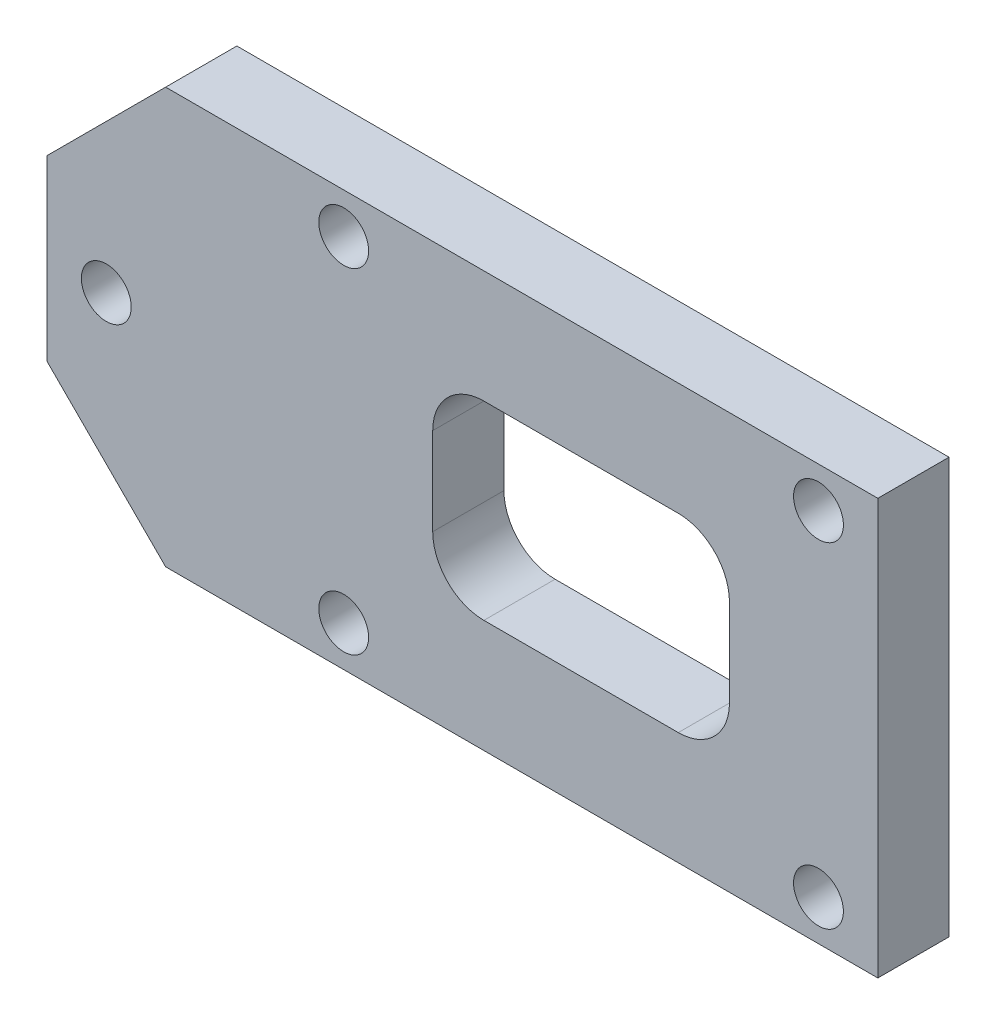
ISO-10303-21;
HEADER;
FILE_DESCRIPTION(('STEP AP214'),'2;1');
FILE_NAME('part.step','',(''),(''),'','','');
FILE_SCHEMA(('AUTOMOTIVE_DESIGN { 1 0 10303 214 1 1 1 1 }'));
ENDSEC;
DATA;
#1=APPLICATION_CONTEXT('core data for automotive mechanical design processes');
#2=APPLICATION_PROTOCOL_DEFINITION('international standard','automotive_design',2000,#1);
#3=PRODUCT_CONTEXT('',#1,'mechanical');
#4=PRODUCT('Part','Part','',(#3));
#5=PRODUCT_RELATED_PRODUCT_CATEGORY('part','',(#4));
#6=PRODUCT_DEFINITION_FORMATION('','',#4);
#7=PRODUCT_DEFINITION_CONTEXT('part definition',#1,'design');
#8=PRODUCT_DEFINITION('design','',#6,#7);
#9=PRODUCT_DEFINITION_SHAPE('','',#8);
#10=(LENGTH_UNIT() NAMED_UNIT(*) SI_UNIT(.MILLI.,.METRE.));
#11=(NAMED_UNIT(*) PLANE_ANGLE_UNIT() SI_UNIT($,.RADIAN.));
#12=(NAMED_UNIT(*) SI_UNIT($,.STERADIAN.) SOLID_ANGLE_UNIT());
#13=UNCERTAINTY_MEASURE_WITH_UNIT(LENGTH_MEASURE(1.E-05),#10,'distance_accuracy_value','');
#14=(GEOMETRIC_REPRESENTATION_CONTEXT(3) GLOBAL_UNCERTAINTY_ASSIGNED_CONTEXT((#13)) GLOBAL_UNIT_ASSIGNED_CONTEXT((#10,
#11,#12)) REPRESENTATION_CONTEXT('',''));
#15=CARTESIAN_POINT('',(0.,0.,0.));
#16=DIRECTION('',(0.,0.,1.));
#17=DIRECTION('',(1.,0.,0.));
#18=AXIS2_PLACEMENT_3D('',#15,#16,#17);
#19=CARTESIAN_POINT('',(0.,0.,6.));
#20=DIRECTION('',(0.,0.,-1.));
#21=DIRECTION('',(-1.,0.,0.));
#22=AXIS2_PLACEMENT_3D('',#19,#20,#21);
#23=PLANE('',#22);
#24=CARTESIAN_POINT('',(5.,17.5,6.));
#25=DIRECTION('',(0.,0.,1.));
#26=DIRECTION('',(1.,0.,0.));
#27=AXIS2_PLACEMENT_3D('',#24,#25,#26);
#28=CIRCLE('',#27,2.1);
#29=CARTESIAN_POINT('',(7.1,17.5,6.));
#30=VERTEX_POINT('',#29);
#31=EDGE_CURVE('E236',#30,#30,#28,.T.);
#32=ORIENTED_EDGE('',*,*,#31,.F.);
#33=EDGE_LOOP('',(#32));
#34=FACE_BOUND('',#33,.T.);
#35=CARTESIAN_POINT('',(25.,3.4,6.));
#36=DIRECTION('',(0.,0.,1.));
#37=DIRECTION('',(-1.,0.,0.));
#38=AXIS2_PLACEMENT_3D('',#35,#36,#37);
#39=CIRCLE('',#38,2.1);
#40=CARTESIAN_POINT('',(22.9,3.4,6.));
#41=VERTEX_POINT('',#40);
#42=EDGE_CURVE('E244',#41,#41,#39,.T.);
#43=ORIENTED_EDGE('',*,*,#42,.F.);
#44=EDGE_LOOP('',(#43));
#45=FACE_BOUND('',#44,.T.);
#46=CARTESIAN_POINT('',(65.,3.4,6.));
#47=DIRECTION('',(0.,0.,1.));
#48=DIRECTION('',(-1.,0.,0.));
#49=AXIS2_PLACEMENT_3D('',#46,#47,#48);
#50=CIRCLE('',#49,2.09999999999999);
#51=CARTESIAN_POINT('',(62.9,3.4,6.));
#52=VERTEX_POINT('',#51);
#53=EDGE_CURVE('E252',#52,#52,#50,.T.);
#54=ORIENTED_EDGE('',*,*,#53,.F.);
#55=EDGE_LOOP('',(#54));
#56=FACE_BOUND('',#55,.T.);
#57=CARTESIAN_POINT('',(25.,31.6,6.));
#58=DIRECTION('',(0.,0.,1.));
#59=DIRECTION('',(1.,0.,0.));
#60=AXIS2_PLACEMENT_3D('',#57,#58,#59);
#61=CIRCLE('',#60,2.1);
#62=CARTESIAN_POINT('',(27.1,31.6,6.));
#63=VERTEX_POINT('',#62);
#64=EDGE_CURVE('E260',#63,#63,#61,.T.);
#65=ORIENTED_EDGE('',*,*,#64,.F.);
#66=EDGE_LOOP('',(#65));
#67=FACE_BOUND('',#66,.T.);
#68=CARTESIAN_POINT('',(65.,31.6,6.));
#69=DIRECTION('',(0.,0.,1.));
#70=DIRECTION('',(1.,0.,0.));
#71=AXIS2_PLACEMENT_3D('',#68,#69,#70);
#72=CIRCLE('',#71,2.09999999999999);
#73=CARTESIAN_POINT('',(67.1,31.6,6.));
#74=VERTEX_POINT('',#73);
#75=EDGE_CURVE('E268',#74,#74,#72,.T.);
#76=ORIENTED_EDGE('',*,*,#75,.F.);
#77=EDGE_LOOP('',(#76));
#78=FACE_BOUND('',#77,.T.);
#79=DIRECTION('',(0.,1.,0.));
#80=VECTOR('',#79,1.);
#81=CARTESIAN_POINT('',(70.,0.,6.));
#82=LINE('',#81,#80);
#83=CARTESIAN_POINT('',(70.,0.,6.));
#84=VERTEX_POINT('',#83);
#85=CARTESIAN_POINT('',(70.,35.,6.));
#86=VERTEX_POINT('',#85);
#87=EDGE_CURVE('E276',#84,#86,#82,.T.);
#88=ORIENTED_EDGE('',*,*,#87,.T.);
#89=DIRECTION('',(-1.,0.,0.));
#90=VECTOR('',#89,1.);
#91=CARTESIAN_POINT('',(10.,35.,6.));
#92=LINE('',#91,#90);
#93=CARTESIAN_POINT('',(10.,35.,6.));
#94=VERTEX_POINT('',#93);
#95=EDGE_CURVE('E280',#86,#94,#92,.T.);
#96=ORIENTED_EDGE('',*,*,#95,.T.);
#97=DIRECTION('',(-0.707106781186547,-0.707106781186548,0.));
#98=VECTOR('',#97,1.);
#99=CARTESIAN_POINT('',(0.,25.,6.));
#100=LINE('',#99,#98);
#101=CARTESIAN_POINT('',(0.,25.,6.));
#102=VERTEX_POINT('',#101);
#103=EDGE_CURVE('E284',#94,#102,#100,.T.);
#104=ORIENTED_EDGE('',*,*,#103,.T.);
#105=DIRECTION('',(0.,-1.,0.));
#106=VECTOR('',#105,1.);
#107=CARTESIAN_POINT('',(0.,10.,6.));
#108=LINE('',#107,#106);
#109=CARTESIAN_POINT('',(0.,10.,6.));
#110=VERTEX_POINT('',#109);
#111=EDGE_CURVE('E287',#102,#110,#108,.T.);
#112=ORIENTED_EDGE('',*,*,#111,.T.);
#113=DIRECTION('',(0.707106781186548,-0.707106781186548,0.));
#114=VECTOR('',#113,1.);
#115=CARTESIAN_POINT('',(10.,0.,6.));
#116=LINE('',#115,#114);
#117=CARTESIAN_POINT('',(10.,0.,6.));
#118=VERTEX_POINT('',#117);
#119=EDGE_CURVE('E290',#110,#118,#116,.T.);
#120=ORIENTED_EDGE('',*,*,#119,.T.);
#121=DIRECTION('',(1.,0.,0.));
#122=VECTOR('',#121,1.);
#123=CARTESIAN_POINT('',(10.,0.,6.));
#124=LINE('',#123,#122);
#125=EDGE_CURVE('E293',#118,#84,#124,.T.);
#126=ORIENTED_EDGE('',*,*,#125,.T.);
#127=EDGE_LOOP('',(#88,#96,#104,#112,#120,#126));
#128=FACE_BOUND('',#127,.T.);
#129=CARTESIAN_POINT('',(36.8110537456806,13.8110537456806,6.));
#130=DIRECTION('',(0.,0.,1.));
#131=DIRECTION('',(1.,0.,0.));
#132=AXIS2_PLACEMENT_3D('',#129,#130,#131);
#133=CIRCLE('',#132,4.31105374568061);
#134=CARTESIAN_POINT('',(32.5,13.8110537456806,6.));
#135=VERTEX_POINT('',#134);
#136=CARTESIAN_POINT('',(36.8110537456806,9.5,6.));
#137=VERTEX_POINT('',#136);
#138=EDGE_CURVE('E147',#135,#137,#133,.T.);
#139=ORIENTED_EDGE('',*,*,#138,.F.);
#140=DIRECTION('',(0.,-1.,0.));
#141=VECTOR('',#140,1.);
#142=CARTESIAN_POINT('',(32.5,13.8110537456806,6.));
#143=LINE('',#142,#141);
#144=CARTESIAN_POINT('',(32.5,21.1889462543194,6.));
#145=VERTEX_POINT('',#144);
#146=EDGE_CURVE('E188',#145,#135,#143,.T.);
#147=ORIENTED_EDGE('',*,*,#146,.F.);
#148=CARTESIAN_POINT('',(36.8110537456806,21.1889462543194,6.));
#149=DIRECTION('',(0.,0.,1.));
#150=DIRECTION('',(1.,0.,0.));
#151=AXIS2_PLACEMENT_3D('',#148,#149,#150);
#152=CIRCLE('',#151,4.31105374568061);
#153=CARTESIAN_POINT('',(36.8110537456806,25.5,6.));
#154=VERTEX_POINT('',#153);
#155=EDGE_CURVE('E185',#154,#145,#152,.T.);
#156=ORIENTED_EDGE('',*,*,#155,.F.);
#157=DIRECTION('',(-1.,0.,0.));
#158=VECTOR('',#157,1.);
#159=CARTESIAN_POINT('',(53.1889462543194,25.5,6.));
#160=LINE('',#159,#158);
#161=CARTESIAN_POINT('',(53.1889462543194,25.5,6.));
#162=VERTEX_POINT('',#161);
#163=EDGE_CURVE('E182',#162,#154,#160,.T.);
#164=ORIENTED_EDGE('',*,*,#163,.F.);
#165=CARTESIAN_POINT('',(53.1889462543194,21.1889462543194,6.));
#166=DIRECTION('',(0.,0.,1.));
#167=DIRECTION('',(1.,0.,0.));
#168=AXIS2_PLACEMENT_3D('',#165,#166,#167);
#169=CIRCLE('',#168,4.3110537456806);
#170=CARTESIAN_POINT('',(57.5,21.1889462543194,6.));
#171=VERTEX_POINT('',#170);
#172=EDGE_CURVE('E179',#171,#162,#169,.T.);
#173=ORIENTED_EDGE('',*,*,#172,.F.);
#174=DIRECTION('',(0.,1.,0.));
#175=VECTOR('',#174,1.);
#176=CARTESIAN_POINT('',(57.5,13.8110537456806,6.));
#177=LINE('',#176,#175);
#178=CARTESIAN_POINT('',(57.5,13.8110537456806,6.));
#179=VERTEX_POINT('',#178);
#180=EDGE_CURVE('E174',#179,#171,#177,.T.);
#181=ORIENTED_EDGE('',*,*,#180,.F.);
#182=CARTESIAN_POINT('',(53.1889462543194,13.8110537456806,6.));
#183=DIRECTION('',(0.,0.,1.));
#184=DIRECTION('',(1.,0.,0.));
#185=AXIS2_PLACEMENT_3D('',#182,#183,#184);
#186=CIRCLE('',#185,4.3110537456806);
#187=CARTESIAN_POINT('',(53.1889462543194,9.50000000000001,6.));
#188=VERTEX_POINT('',#187);
#189=EDGE_CURVE('E170',#188,#179,#186,.T.);
#190=ORIENTED_EDGE('',*,*,#189,.F.);
#191=DIRECTION('',(1.,0.,0.));
#192=VECTOR('',#191,1.);
#193=CARTESIAN_POINT('',(53.1889462543194,9.5,6.));
#194=LINE('',#193,#192);
#195=EDGE_CURVE('E156',#137,#188,#194,.T.);
#196=ORIENTED_EDGE('',*,*,#195,.F.);
#197=EDGE_LOOP('',(#139,#147,#156,#164,#173,#181,#190,#196));
#198=FACE_BOUND('',#197,.T.);
#199=ADVANCED_FACE('F45',(#34,#45,#56,#67,#78,#128,#198),#23,.F.);
#200=CARTESIAN_POINT('',(0.,0.,0.));
#201=DIRECTION('',(0.,0.,-1.));
#202=DIRECTION('',(-1.,0.,0.));
#203=AXIS2_PLACEMENT_3D('',#200,#201,#202);
#204=PLANE('',#203);
#205=CARTESIAN_POINT('',(25.,3.4,0.));
#206=DIRECTION('',(0.,0.,1.));
#207=DIRECTION('',(-1.,0.,0.));
#208=AXIS2_PLACEMENT_3D('',#205,#206,#207);
#209=CIRCLE('',#208,2.1);
#210=CARTESIAN_POINT('',(22.9,3.4,0.));
#211=VERTEX_POINT('',#210);
#212=EDGE_CURVE('E240',#211,#211,#209,.T.);
#213=ORIENTED_EDGE('',*,*,#212,.T.);
#214=EDGE_LOOP('',(#213));
#215=FACE_BOUND('',#214,.T.);
#216=CARTESIAN_POINT('',(25.,31.6,0.));
#217=DIRECTION('',(0.,0.,1.));
#218=DIRECTION('',(1.,0.,0.));
#219=AXIS2_PLACEMENT_3D('',#216,#217,#218);
#220=CIRCLE('',#219,2.1);
#221=CARTESIAN_POINT('',(27.1,31.6,0.));
#222=VERTEX_POINT('',#221);
#223=EDGE_CURVE('E256',#222,#222,#220,.T.);
#224=ORIENTED_EDGE('',*,*,#223,.T.);
#225=EDGE_LOOP('',(#224));
#226=FACE_BOUND('',#225,.T.);
#227=DIRECTION('',(0.,1.,0.));
#228=VECTOR('',#227,1.);
#229=CARTESIAN_POINT('',(70.,0.,0.));
#230=LINE('',#229,#228);
#231=CARTESIAN_POINT('',(70.,0.,0.));
#232=VERTEX_POINT('',#231);
#233=CARTESIAN_POINT('',(70.,35.,0.));
#234=VERTEX_POINT('',#233);
#235=EDGE_CURVE('E272',#232,#234,#230,.T.);
#236=ORIENTED_EDGE('',*,*,#235,.F.);
#237=DIRECTION('',(1.,0.,0.));
#238=VECTOR('',#237,1.);
#239=CARTESIAN_POINT('',(10.,0.,0.));
#240=LINE('',#239,#238);
#241=CARTESIAN_POINT('',(10.,0.,0.));
#242=VERTEX_POINT('',#241);
#243=EDGE_CURVE('E281',#242,#232,#240,.T.);
#244=ORIENTED_EDGE('',*,*,#243,.F.);
#245=DIRECTION('',(0.707106781186548,-0.707106781186548,0.));
#246=VECTOR('',#245,1.);
#247=CARTESIAN_POINT('',(10.,0.,0.));
#248=LINE('',#247,#246);
#249=CARTESIAN_POINT('',(0.,10.,0.));
#250=VERTEX_POINT('',#249);
#251=EDGE_CURVE('E309',#250,#242,#248,.T.);
#252=ORIENTED_EDGE('',*,*,#251,.F.);
#253=DIRECTION('',(0.,-1.,0.));
#254=VECTOR('',#253,1.);
#255=CARTESIAN_POINT('',(0.,10.,0.));
#256=LINE('',#255,#254);
#257=CARTESIAN_POINT('',(0.,25.,0.));
#258=VERTEX_POINT('',#257);
#259=EDGE_CURVE('E306',#258,#250,#256,.T.);
#260=ORIENTED_EDGE('',*,*,#259,.F.);
#261=DIRECTION('',(-0.707106781186547,-0.707106781186548,0.));
#262=VECTOR('',#261,1.);
#263=CARTESIAN_POINT('',(0.,25.,0.));
#264=LINE('',#263,#262);
#265=CARTESIAN_POINT('',(10.,35.,0.));
#266=VERTEX_POINT('',#265);
#267=EDGE_CURVE('E303',#266,#258,#264,.T.);
#268=ORIENTED_EDGE('',*,*,#267,.F.);
#269=DIRECTION('',(-1.,0.,0.));
#270=VECTOR('',#269,1.);
#271=CARTESIAN_POINT('',(10.,35.,0.));
#272=LINE('',#271,#270);
#273=EDGE_CURVE('E300',#234,#266,#272,.T.);
#274=ORIENTED_EDGE('',*,*,#273,.F.);
#275=EDGE_LOOP('',(#236,#244,#252,#260,#268,#274));
#276=FACE_BOUND('',#275,.T.);
#277=CARTESIAN_POINT('',(65.,31.6,0.));
#278=DIRECTION('',(0.,0.,1.));
#279=DIRECTION('',(1.,0.,0.));
#280=AXIS2_PLACEMENT_3D('',#277,#278,#279);
#281=CIRCLE('',#280,2.09999999999999);
#282=CARTESIAN_POINT('',(67.1,31.6,0.));
#283=VERTEX_POINT('',#282);
#284=EDGE_CURVE('E264',#283,#283,#281,.T.);
#285=ORIENTED_EDGE('',*,*,#284,.T.);
#286=EDGE_LOOP('',(#285));
#287=FACE_BOUND('',#286,.T.);
#288=CARTESIAN_POINT('',(65.,3.4,0.));
#289=DIRECTION('',(0.,0.,1.));
#290=DIRECTION('',(-1.,0.,0.));
#291=AXIS2_PLACEMENT_3D('',#288,#289,#290);
#292=CIRCLE('',#291,2.09999999999999);
#293=CARTESIAN_POINT('',(62.9,3.4,0.));
#294=VERTEX_POINT('',#293);
#295=EDGE_CURVE('E248',#294,#294,#292,.T.);
#296=ORIENTED_EDGE('',*,*,#295,.T.);
#297=EDGE_LOOP('',(#296));
#298=FACE_BOUND('',#297,.T.);
#299=CARTESIAN_POINT('',(5.,17.5,0.));
#300=DIRECTION('',(0.,0.,1.));
#301=DIRECTION('',(1.,0.,0.));
#302=AXIS2_PLACEMENT_3D('',#299,#300,#301);
#303=CIRCLE('',#302,2.1);
#304=CARTESIAN_POINT('',(7.1,17.5,0.));
#305=VERTEX_POINT('',#304);
#306=EDGE_CURVE('E165',#305,#305,#303,.T.);
#307=ORIENTED_EDGE('',*,*,#306,.T.);
#308=EDGE_LOOP('',(#307));
#309=FACE_BOUND('',#308,.T.);
#310=DIRECTION('',(0.,-1.,0.));
#311=VECTOR('',#310,1.);
#312=CARTESIAN_POINT('',(32.5,13.8110537456806,0.));
#313=LINE('',#312,#311);
#314=CARTESIAN_POINT('',(32.5,21.1889462543194,0.));
#315=VERTEX_POINT('',#314);
#316=CARTESIAN_POINT('',(32.5,13.8110537456806,0.));
#317=VERTEX_POINT('',#316);
#318=EDGE_CURVE('E157',#315,#317,#313,.T.);
#319=ORIENTED_EDGE('',*,*,#318,.T.);
#320=CARTESIAN_POINT('',(36.8110537456806,13.8110537456806,0.));
#321=DIRECTION('',(0.,0.,1.));
#322=DIRECTION('',(1.,0.,0.));
#323=AXIS2_PLACEMENT_3D('',#320,#321,#322);
#324=CIRCLE('',#323,4.31105374568061);
#325=CARTESIAN_POINT('',(36.8110537456806,9.5,0.));
#326=VERTEX_POINT('',#325);
#327=EDGE_CURVE('E69',#317,#326,#324,.T.);
#328=ORIENTED_EDGE('',*,*,#327,.T.);
#329=DIRECTION('',(1.,0.,0.));
#330=VECTOR('',#329,1.);
#331=CARTESIAN_POINT('',(53.1889462543194,9.5,0.));
#332=LINE('',#331,#330);
#333=CARTESIAN_POINT('',(53.1889462543194,9.50000000000001,0.));
#334=VERTEX_POINT('',#333);
#335=EDGE_CURVE('E163',#326,#334,#332,.T.);
#336=ORIENTED_EDGE('',*,*,#335,.T.);
#337=CARTESIAN_POINT('',(53.1889462543194,13.8110537456806,0.));
#338=DIRECTION('',(0.,0.,1.));
#339=DIRECTION('',(1.,0.,0.));
#340=AXIS2_PLACEMENT_3D('',#337,#338,#339);
#341=CIRCLE('',#340,4.3110537456806);
#342=CARTESIAN_POINT('',(57.5,13.8110537456806,0.));
#343=VERTEX_POINT('',#342);
#344=EDGE_CURVE('E195',#334,#343,#341,.T.);
#345=ORIENTED_EDGE('',*,*,#344,.T.);
#346=DIRECTION('',(0.,1.,0.));
#347=VECTOR('',#346,1.);
#348=CARTESIAN_POINT('',(57.5,13.8110537456806,0.));
#349=LINE('',#348,#347);
#350=CARTESIAN_POINT('',(57.5,21.1889462543194,0.));
#351=VERTEX_POINT('',#350);
#352=EDGE_CURVE('E199',#343,#351,#349,.T.);
#353=ORIENTED_EDGE('',*,*,#352,.T.);
#354=CARTESIAN_POINT('',(53.1889462543194,21.1889462543194,0.));
#355=DIRECTION('',(0.,0.,1.));
#356=DIRECTION('',(1.,0.,0.));
#357=AXIS2_PLACEMENT_3D('',#354,#355,#356);
#358=CIRCLE('',#357,4.3110537456806);
#359=CARTESIAN_POINT('',(53.1889462543194,25.5,0.));
#360=VERTEX_POINT('',#359);
#361=EDGE_CURVE('E203',#351,#360,#358,.T.);
#362=ORIENTED_EDGE('',*,*,#361,.T.);
#363=DIRECTION('',(-1.,0.,0.));
#364=VECTOR('',#363,1.);
#365=CARTESIAN_POINT('',(53.1889462543194,25.5,0.));
#366=LINE('',#365,#364);
#367=CARTESIAN_POINT('',(36.8110537456806,25.5,0.));
#368=VERTEX_POINT('',#367);
#369=EDGE_CURVE('E207',#360,#368,#366,.T.);
#370=ORIENTED_EDGE('',*,*,#369,.T.);
#371=CARTESIAN_POINT('',(36.8110537456806,21.1889462543194,0.));
#372=DIRECTION('',(0.,0.,1.));
#373=DIRECTION('',(1.,0.,0.));
#374=AXIS2_PLACEMENT_3D('',#371,#372,#373);
#375=CIRCLE('',#374,4.31105374568061);
#376=EDGE_CURVE('E211',#368,#315,#375,.T.);
#377=ORIENTED_EDGE('',*,*,#376,.T.);
#378=EDGE_LOOP('',(#319,#328,#336,#345,#353,#362,#370,#377));
#379=FACE_BOUND('',#378,.T.);
#380=ADVANCED_FACE('F340',(#215,#226,#276,#287,#298,#309,#379),#204,.T.);
#381=CARTESIAN_POINT('',(70.,0.,6.));
#382=DIRECTION('',(-1.,0.,0.));
#383=DIRECTION('',(0.,0.,1.));
#384=AXIS2_PLACEMENT_3D('',#381,#382,#383);
#385=PLANE('',#384);
#386=ORIENTED_EDGE('',*,*,#235,.T.);
#387=DIRECTION('',(0.,0.,-1.));
#388=VECTOR('',#387,1.);
#389=CARTESIAN_POINT('',(70.,35.,6.));
#390=LINE('',#389,#388);
#391=EDGE_CURVE('E11',#86,#234,#390,.T.);
#392=ORIENTED_EDGE('',*,*,#391,.F.);
#393=ORIENTED_EDGE('',*,*,#87,.F.);
#394=DIRECTION('',(0.,0.,-1.));
#395=VECTOR('',#394,1.);
#396=CARTESIAN_POINT('',(70.,0.,6.));
#397=LINE('',#396,#395);
#398=EDGE_CURVE('E296',#84,#232,#397,.T.);
#399=ORIENTED_EDGE('',*,*,#398,.T.);
#400=EDGE_LOOP('',(#386,#392,#393,#399));
#401=FACE_BOUND('',#400,.T.);
#402=ADVANCED_FACE('F47',(#401),#385,.F.);
#403=CARTESIAN_POINT('',(10.,35.,6.));
#404=DIRECTION('',(0.,-1.,0.));
#405=DIRECTION('',(0.,0.,-1.));
#406=AXIS2_PLACEMENT_3D('',#403,#404,#405);
#407=PLANE('',#406);
#408=ORIENTED_EDGE('',*,*,#273,.T.);
#409=DIRECTION('',(0.,0.,-1.));
#410=VECTOR('',#409,1.);
#411=CARTESIAN_POINT('',(10.,35.,6.));
#412=LINE('',#411,#410);
#413=EDGE_CURVE('E54',#94,#266,#412,.T.);
#414=ORIENTED_EDGE('',*,*,#413,.F.);
#415=ORIENTED_EDGE('',*,*,#95,.F.);
#416=ORIENTED_EDGE('',*,*,#391,.T.);
#417=EDGE_LOOP('',(#408,#414,#415,#416));
#418=FACE_BOUND('',#417,.T.);
#419=ADVANCED_FACE('F357',(#418),#407,.F.);
#420=CARTESIAN_POINT('',(0.,25.,6.));
#421=DIRECTION('',(0.707106781186548,-0.707106781186547,0.));
#422=DIRECTION('',(0.707106781186547,0.707106781186548,0.));
#423=AXIS2_PLACEMENT_3D('',#420,#421,#422);
#424=PLANE('',#423);
#425=ORIENTED_EDGE('',*,*,#267,.T.);
#426=DIRECTION('',(0.,0.,-1.));
#427=VECTOR('',#426,1.);
#428=CARTESIAN_POINT('',(0.,25.,6.));
#429=LINE('',#428,#427);
#430=EDGE_CURVE('E325',#102,#258,#429,.T.);
#431=ORIENTED_EDGE('',*,*,#430,.F.);
#432=ORIENTED_EDGE('',*,*,#103,.F.);
#433=ORIENTED_EDGE('',*,*,#413,.T.);
#434=EDGE_LOOP('',(#425,#431,#432,#433));
#435=FACE_BOUND('',#434,.T.);
#436=ADVANCED_FACE('F334',(#435),#424,.F.);
#437=CARTESIAN_POINT('',(0.,10.,6.));
#438=DIRECTION('',(1.,0.,0.));
#439=DIRECTION('',(0.,0.,-1.));
#440=AXIS2_PLACEMENT_3D('',#437,#438,#439);
#441=PLANE('',#440);
#442=ORIENTED_EDGE('',*,*,#259,.T.);
#443=DIRECTION('',(0.,0.,-1.));
#444=VECTOR('',#443,1.);
#445=CARTESIAN_POINT('',(0.,10.,6.));
#446=LINE('',#445,#444);
#447=EDGE_CURVE('E321',#110,#250,#446,.T.);
#448=ORIENTED_EDGE('',*,*,#447,.F.);
#449=ORIENTED_EDGE('',*,*,#111,.F.);
#450=ORIENTED_EDGE('',*,*,#430,.T.);
#451=EDGE_LOOP('',(#442,#448,#449,#450));
#452=FACE_BOUND('',#451,.T.);
#453=ADVANCED_FACE('F346',(#452),#441,.F.);
#454=CARTESIAN_POINT('',(10.,0.,6.));
#455=DIRECTION('',(0.707106781186547,0.707106781186547,0.));
#456=DIRECTION('',(-0.707106781186548,0.707106781186548,0.));
#457=AXIS2_PLACEMENT_3D('',#454,#455,#456);
#458=PLANE('',#457);
#459=ORIENTED_EDGE('',*,*,#251,.T.);
#460=DIRECTION('',(0.,0.,-1.));
#461=VECTOR('',#460,1.);
#462=CARTESIAN_POINT('',(10.,0.,6.));
#463=LINE('',#462,#461);
#464=EDGE_CURVE('E317',#118,#242,#463,.T.);
#465=ORIENTED_EDGE('',*,*,#464,.F.);
#466=ORIENTED_EDGE('',*,*,#119,.F.);
#467=ORIENTED_EDGE('',*,*,#447,.T.);
#468=EDGE_LOOP('',(#459,#465,#466,#467));
#469=FACE_BOUND('',#468,.T.);
#470=ADVANCED_FACE('F350',(#469),#458,.F.);
#471=CARTESIAN_POINT('',(10.,0.,6.));
#472=DIRECTION('',(0.,1.,0.));
#473=DIRECTION('',(0.,0.,1.));
#474=AXIS2_PLACEMENT_3D('',#471,#472,#473);
#475=PLANE('',#474);
#476=ORIENTED_EDGE('',*,*,#243,.T.);
#477=ORIENTED_EDGE('',*,*,#398,.F.);
#478=ORIENTED_EDGE('',*,*,#125,.F.);
#479=ORIENTED_EDGE('',*,*,#464,.T.);
#480=EDGE_LOOP('',(#476,#477,#478,#479));
#481=FACE_BOUND('',#480,.T.);
#482=ADVANCED_FACE('F360',(#481),#475,.F.);
#483=CARTESIAN_POINT('',(65.,31.6,6.));
#484=DIRECTION('',(0.,0.,-1.));
#485=DIRECTION('',(-1.,0.,0.));
#486=AXIS2_PLACEMENT_3D('',#483,#484,#485);
#487=CYLINDRICAL_SURFACE('',#486,2.09999999999999);
#488=ORIENTED_EDGE('',*,*,#75,.T.);
#489=EDGE_LOOP('',(#488));
#490=FACE_BOUND('',#489,.T.);
#491=ORIENTED_EDGE('',*,*,#284,.F.);
#492=EDGE_LOOP('',(#491));
#493=FACE_BOUND('',#492,.T.);
#494=ADVANCED_FACE('F362',(#490,#493),#487,.F.);
#495=CARTESIAN_POINT('',(25.,31.6,6.));
#496=DIRECTION('',(0.,0.,-1.));
#497=DIRECTION('',(-1.,0.,0.));
#498=AXIS2_PLACEMENT_3D('',#495,#496,#497);
#499=CYLINDRICAL_SURFACE('',#498,2.1);
#500=ORIENTED_EDGE('',*,*,#64,.T.);
#501=EDGE_LOOP('',(#500));
#502=FACE_BOUND('',#501,.T.);
#503=ORIENTED_EDGE('',*,*,#223,.F.);
#504=EDGE_LOOP('',(#503));
#505=FACE_BOUND('',#504,.T.);
#506=ADVANCED_FACE('F368',(#502,#505),#499,.F.);
#507=CARTESIAN_POINT('',(65.,3.4,6.));
#508=DIRECTION('',(0.,0.,-1.));
#509=DIRECTION('',(-1.,0.,0.));
#510=AXIS2_PLACEMENT_3D('',#507,#508,#509);
#511=CYLINDRICAL_SURFACE('',#510,2.09999999999999);
#512=ORIENTED_EDGE('',*,*,#53,.T.);
#513=EDGE_LOOP('',(#512));
#514=FACE_BOUND('',#513,.T.);
#515=ORIENTED_EDGE('',*,*,#295,.F.);
#516=EDGE_LOOP('',(#515));
#517=FACE_BOUND('',#516,.T.);
#518=ADVANCED_FACE('F385',(#514,#517),#511,.F.);
#519=CARTESIAN_POINT('',(25.,3.4,6.));
#520=DIRECTION('',(0.,0.,-1.));
#521=DIRECTION('',(-1.,0.,0.));
#522=AXIS2_PLACEMENT_3D('',#519,#520,#521);
#523=CYLINDRICAL_SURFACE('',#522,2.1);
#524=ORIENTED_EDGE('',*,*,#42,.T.);
#525=EDGE_LOOP('',(#524));
#526=FACE_BOUND('',#525,.T.);
#527=ORIENTED_EDGE('',*,*,#212,.F.);
#528=EDGE_LOOP('',(#527));
#529=FACE_BOUND('',#528,.T.);
#530=ADVANCED_FACE('F389',(#526,#529),#523,.F.);
#531=CARTESIAN_POINT('',(5.,17.5,6.));
#532=DIRECTION('',(0.,0.,-1.));
#533=DIRECTION('',(-1.,0.,0.));
#534=AXIS2_PLACEMENT_3D('',#531,#532,#533);
#535=CYLINDRICAL_SURFACE('',#534,2.1);
#536=ORIENTED_EDGE('',*,*,#31,.T.);
#537=EDGE_LOOP('',(#536));
#538=FACE_BOUND('',#537,.T.);
#539=ORIENTED_EDGE('',*,*,#306,.F.);
#540=EDGE_LOOP('',(#539));
#541=FACE_BOUND('',#540,.T.);
#542=ADVANCED_FACE('F393',(#538,#541),#535,.F.);
#543=CARTESIAN_POINT('',(36.8110537456806,13.8110537456806,6.));
#544=DIRECTION('',(0.,0.,-1.));
#545=DIRECTION('',(-1.,0.,0.));
#546=AXIS2_PLACEMENT_3D('',#543,#544,#545);
#547=CYLINDRICAL_SURFACE('',#546,4.31105374568061);
#548=ORIENTED_EDGE('',*,*,#327,.F.);
#549=DIRECTION('',(0.,0.,-1.));
#550=VECTOR('',#549,1.);
#551=CARTESIAN_POINT('',(32.5,13.8110537456806,6.));
#552=LINE('',#551,#550);
#553=EDGE_CURVE('E151',#135,#317,#552,.T.);
#554=ORIENTED_EDGE('',*,*,#553,.F.);
#555=ORIENTED_EDGE('',*,*,#138,.T.);
#556=DIRECTION('',(0.,0.,-1.));
#557=VECTOR('',#556,1.);
#558=CARTESIAN_POINT('',(36.8110537456806,9.5,6.));
#559=LINE('',#558,#557);
#560=EDGE_CURVE('E150',#137,#326,#559,.T.);
#561=ORIENTED_EDGE('',*,*,#560,.T.);
#562=EDGE_LOOP('',(#548,#554,#555,#561));
#563=FACE_BOUND('',#562,.T.);
#564=ADVANCED_FACE('F149',(#563),#547,.F.);
#565=CARTESIAN_POINT('',(53.1889462543194,9.5,6.));
#566=DIRECTION('',(0.,1.,0.));
#567=DIRECTION('',(-1.,0.,0.));
#568=AXIS2_PLACEMENT_3D('',#565,#566,#567);
#569=PLANE('',#568);
#570=ORIENTED_EDGE('',*,*,#335,.F.);
#571=ORIENTED_EDGE('',*,*,#560,.F.);
#572=ORIENTED_EDGE('',*,*,#195,.T.);
#573=DIRECTION('',(0.,0.,-1.));
#574=VECTOR('',#573,1.);
#575=CARTESIAN_POINT('',(53.1889462543194,9.50000000000001,6.));
#576=LINE('',#575,#574);
#577=EDGE_CURVE('E166',#188,#334,#576,.T.);
#578=ORIENTED_EDGE('',*,*,#577,.T.);
#579=EDGE_LOOP('',(#570,#571,#572,#578));
#580=FACE_BOUND('',#579,.T.);
#581=ADVANCED_FACE('F160',(#580),#569,.T.);
#582=CARTESIAN_POINT('',(53.1889462543194,13.8110537456806,6.));
#583=DIRECTION('',(0.,0.,-1.));
#584=DIRECTION('',(-1.,0.,0.));
#585=AXIS2_PLACEMENT_3D('',#582,#583,#584);
#586=CYLINDRICAL_SURFACE('',#585,4.3110537456806);
#587=ORIENTED_EDGE('',*,*,#344,.F.);
#588=ORIENTED_EDGE('',*,*,#577,.F.);
#589=ORIENTED_EDGE('',*,*,#189,.T.);
#590=DIRECTION('',(0.,0.,-1.));
#591=VECTOR('',#590,1.);
#592=CARTESIAN_POINT('',(57.5,13.8110537456806,6.));
#593=LINE('',#592,#591);
#594=EDGE_CURVE('E231',#179,#343,#593,.T.);
#595=ORIENTED_EDGE('',*,*,#594,.T.);
#596=EDGE_LOOP('',(#587,#588,#589,#595));
#597=FACE_BOUND('',#596,.T.);
#598=ADVANCED_FACE('F402',(#597),#586,.F.);
#599=CARTESIAN_POINT('',(57.5,13.8110537456806,6.));
#600=DIRECTION('',(-1.,0.,0.));
#601=DIRECTION('',(0.,0.,1.));
#602=AXIS2_PLACEMENT_3D('',#599,#600,#601);
#603=PLANE('',#602);
#604=ORIENTED_EDGE('',*,*,#352,.F.);
#605=ORIENTED_EDGE('',*,*,#594,.F.);
#606=ORIENTED_EDGE('',*,*,#180,.T.);
#607=DIRECTION('',(0.,0.,-1.));
#608=VECTOR('',#607,1.);
#609=CARTESIAN_POINT('',(57.5,21.1889462543194,6.));
#610=LINE('',#609,#608);
#611=EDGE_CURVE('E228',#171,#351,#610,.T.);
#612=ORIENTED_EDGE('',*,*,#611,.T.);
#613=EDGE_LOOP('',(#604,#605,#606,#612));
#614=FACE_BOUND('',#613,.T.);
#615=ADVANCED_FACE('F405',(#614),#603,.T.);
#616=CARTESIAN_POINT('',(53.1889462543194,21.1889462543194,6.));
#617=DIRECTION('',(0.,0.,-1.));
#618=DIRECTION('',(-1.,0.,0.));
#619=AXIS2_PLACEMENT_3D('',#616,#617,#618);
#620=CYLINDRICAL_SURFACE('',#619,4.3110537456806);
#621=ORIENTED_EDGE('',*,*,#361,.F.);
#622=ORIENTED_EDGE('',*,*,#611,.F.);
#623=ORIENTED_EDGE('',*,*,#172,.T.);
#624=DIRECTION('',(0.,0.,-1.));
#625=VECTOR('',#624,1.);
#626=CARTESIAN_POINT('',(53.1889462543194,25.5,6.));
#627=LINE('',#626,#625);
#628=EDGE_CURVE('E225',#162,#360,#627,.T.);
#629=ORIENTED_EDGE('',*,*,#628,.T.);
#630=EDGE_LOOP('',(#621,#622,#623,#629));
#631=FACE_BOUND('',#630,.T.);
#632=ADVANCED_FACE('F409',(#631),#620,.F.);
#633=CARTESIAN_POINT('',(53.1889462543194,25.5,6.));
#634=DIRECTION('',(0.,-1.,0.));
#635=DIRECTION('',(0.,0.,-1.));
#636=AXIS2_PLACEMENT_3D('',#633,#634,#635);
#637=PLANE('',#636);
#638=ORIENTED_EDGE('',*,*,#369,.F.);
#639=ORIENTED_EDGE('',*,*,#628,.F.);
#640=ORIENTED_EDGE('',*,*,#163,.T.);
#641=DIRECTION('',(0.,0.,-1.));
#642=VECTOR('',#641,1.);
#643=CARTESIAN_POINT('',(36.8110537456806,25.5,6.));
#644=LINE('',#643,#642);
#645=EDGE_CURVE('E222',#154,#368,#644,.T.);
#646=ORIENTED_EDGE('',*,*,#645,.T.);
#647=EDGE_LOOP('',(#638,#639,#640,#646));
#648=FACE_BOUND('',#647,.T.);
#649=ADVANCED_FACE('F413',(#648),#637,.T.);
#650=CARTESIAN_POINT('',(36.8110537456806,21.1889462543194,6.));
#651=DIRECTION('',(0.,0.,-1.));
#652=DIRECTION('',(-1.,0.,0.));
#653=AXIS2_PLACEMENT_3D('',#650,#651,#652);
#654=CYLINDRICAL_SURFACE('',#653,4.31105374568061);
#655=ORIENTED_EDGE('',*,*,#376,.F.);
#656=ORIENTED_EDGE('',*,*,#645,.F.);
#657=ORIENTED_EDGE('',*,*,#155,.T.);
#658=DIRECTION('',(0.,0.,-1.));
#659=VECTOR('',#658,1.);
#660=CARTESIAN_POINT('',(32.5,21.1889462543194,6.));
#661=LINE('',#660,#659);
#662=EDGE_CURVE('E61',#145,#315,#661,.T.);
#663=ORIENTED_EDGE('',*,*,#662,.T.);
#664=EDGE_LOOP('',(#655,#656,#657,#663));
#665=FACE_BOUND('',#664,.T.);
#666=ADVANCED_FACE('F417',(#665),#654,.F.);
#667=CARTESIAN_POINT('',(32.5,13.8110537456806,6.));
#668=DIRECTION('',(1.,0.,0.));
#669=DIRECTION('',(0.,0.,-1.));
#670=AXIS2_PLACEMENT_3D('',#667,#668,#669);
#671=PLANE('',#670);
#672=ORIENTED_EDGE('',*,*,#318,.F.);
#673=ORIENTED_EDGE('',*,*,#662,.F.);
#674=ORIENTED_EDGE('',*,*,#146,.T.);
#675=ORIENTED_EDGE('',*,*,#553,.T.);
#676=EDGE_LOOP('',(#672,#673,#674,#675));
#677=FACE_BOUND('',#676,.T.);
#678=ADVANCED_FACE('F421',(#677),#671,.T.);
#679=CLOSED_SHELL('',(#199,#380,#402,#419,#436,#453,#470,#482,#494,#506,#518,#530,#542,#564,
#581,#598,#615,#632,#649,#666,#678));
#680=MANIFOLD_SOLID_BREP('B2',#679);
#681=ADVANCED_BREP_SHAPE_REPRESENTATION('',(#18,#680),#14);
#682=SHAPE_DEFINITION_REPRESENTATION(#9,#681);
ENDSEC;
END-ISO-10303-21;
